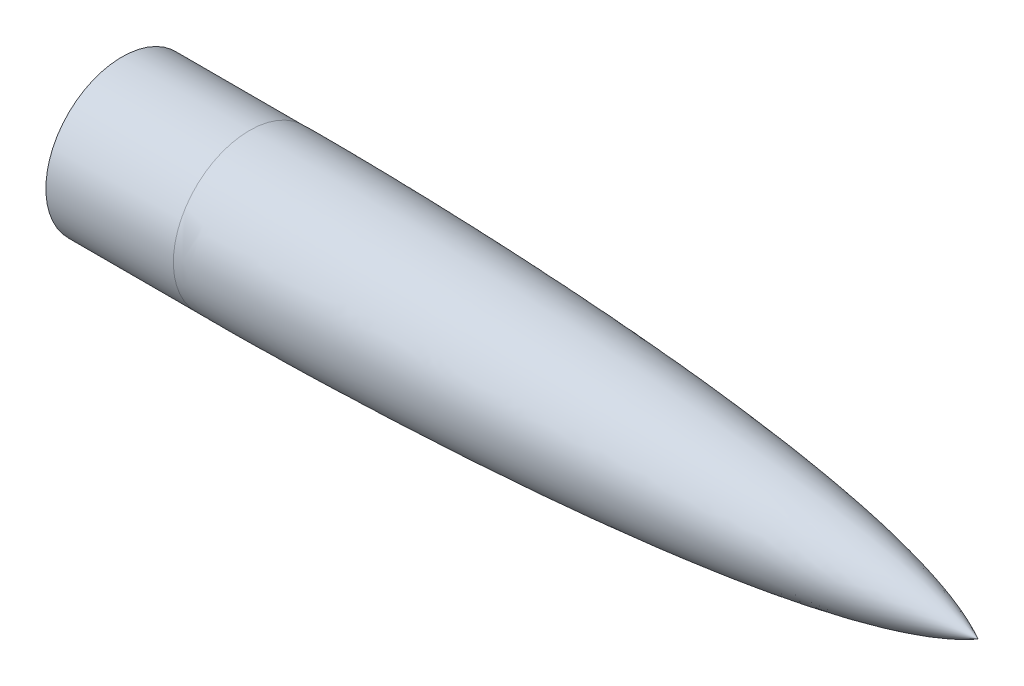
ISO-10303-21;
HEADER;
FILE_DESCRIPTION(('STEP AP214'),'2;1');
FILE_NAME('part.step','',(''),(''),'','','');
FILE_SCHEMA(('AUTOMOTIVE_DESIGN { 1 0 10303 214 1 1 1 1 }'));
ENDSEC;
DATA;
#1=APPLICATION_CONTEXT('core data for automotive mechanical design processes');
#2=APPLICATION_PROTOCOL_DEFINITION('international standard','automotive_design',2000,#1);
#3=PRODUCT_CONTEXT('',#1,'mechanical');
#4=PRODUCT('Part','Part','',(#3));
#5=PRODUCT_RELATED_PRODUCT_CATEGORY('part','',(#4));
#6=PRODUCT_DEFINITION_FORMATION('','',#4);
#7=PRODUCT_DEFINITION_CONTEXT('part definition',#1,'design');
#8=PRODUCT_DEFINITION('design','',#6,#7);
#9=PRODUCT_DEFINITION_SHAPE('','',#8);
#10=(LENGTH_UNIT() NAMED_UNIT(*) SI_UNIT(.MILLI.,.METRE.));
#11=(NAMED_UNIT(*) PLANE_ANGLE_UNIT() SI_UNIT($,.RADIAN.));
#12=(NAMED_UNIT(*) SI_UNIT($,.STERADIAN.) SOLID_ANGLE_UNIT());
#13=UNCERTAINTY_MEASURE_WITH_UNIT(LENGTH_MEASURE(1.E-05),#10,'distance_accuracy_value','');
#14=(GEOMETRIC_REPRESENTATION_CONTEXT(3) GLOBAL_UNCERTAINTY_ASSIGNED_CONTEXT((#13)) GLOBAL_UNIT_ASSIGNED_CONTEXT((#10,
#11,#12)) REPRESENTATION_CONTEXT('',''));
#15=CARTESIAN_POINT('',(0.,0.,0.));
#16=DIRECTION('',(0.,0.,1.));
#17=DIRECTION('',(1.,0.,0.));
#18=AXIS2_PLACEMENT_3D('',#15,#16,#17);
#19=CARTESIAN_POINT('',(200.,0.,0.));
#20=CARTESIAN_POINT('',(163.177563928807,19.7644163472466,0.));
#21=CARTESIAN_POINT('',(23.6648478521144,21.1638456584693,0.));
#22=CARTESIAN_POINT('',(0.,20.8999004893277,0.));
#23=B_SPLINE_CURVE_WITH_KNOTS('',3,(#19,#20,#21,#22),.UNSPECIFIED.,.F.,.F.,(4,4),(0.,1.),.UNSPECIFIED.);
#24=CARTESIAN_POINT('',(0.,0.,0.));
#25=DIRECTION('',(1.,0.,0.));
#26=AXIS1_PLACEMENT('',#24,#25);
#27=SURFACE_OF_REVOLUTION('',#23,#26);
#28=CARTESIAN_POINT('',(0.,0.,0.));
#29=DIRECTION('',(1.,0.,0.));
#30=DIRECTION('',(0.,0.,-1.));
#31=AXIS2_PLACEMENT_3D('',#28,#29,#30);
#32=CIRCLE('',#31,20.8999004893277);
#33=CARTESIAN_POINT('',(0.,0.,-20.8999004893277));
#34=VERTEX_POINT('',#33);
#35=EDGE_CURVE('E11',#34,#34,#32,.T.);
#36=ORIENTED_EDGE('',*,*,#35,.T.);
#37=EDGE_LOOP('',(#36));
#38=FACE_BOUND('',#37,.T.);
#39=CARTESIAN_POINT('',(200.,0.,0.));
#40=VERTEX_POINT('',#39);
#41=VERTEX_LOOP('',#40);
#42=FACE_BOUND('',#41,.T.);
#43=ADVANCED_FACE('F43',(#38,#42),#27,.F.);
#44=CARTESIAN_POINT('',(0.,0.,0.));
#45=DIRECTION('',(1.,0.,0.));
#46=DIRECTION('',(0.,0.,-1.));
#47=AXIS2_PLACEMENT_3D('',#44,#45,#46);
#48=CYLINDRICAL_SURFACE('',#47,20.8999004893277);
#49=CARTESIAN_POINT('',(-35.,0.,0.));
#50=DIRECTION('',(1.,0.,0.));
#51=DIRECTION('',(0.,0.,-1.));
#52=AXIS2_PLACEMENT_3D('',#49,#50,#51);
#53=CIRCLE('',#52,20.8999004893277);
#54=CARTESIAN_POINT('',(-35.,0.,-20.8999004893277));
#55=VERTEX_POINT('',#54);
#56=EDGE_CURVE('E50',#55,#55,#53,.T.);
#57=ORIENTED_EDGE('',*,*,#56,.T.);
#58=EDGE_LOOP('',(#57));
#59=FACE_BOUND('',#58,.T.);
#60=ORIENTED_EDGE('',*,*,#35,.F.);
#61=EDGE_LOOP('',(#60));
#62=FACE_BOUND('',#61,.T.);
#63=ADVANCED_FACE('F54',(#59,#62),#48,.T.);
#64=CARTESIAN_POINT('',(-35.,20.8999004893277,0.));
#65=DIRECTION('',(-1.,0.,0.));
#66=DIRECTION('',(0.,0.,1.));
#67=AXIS2_PLACEMENT_3D('',#64,#65,#66);
#68=PLANE('',#67);
#69=CARTESIAN_POINT('',(-35.,0.,0.));
#70=DIRECTION('',(1.,0.,0.));
#71=DIRECTION('',(0.,0.,-1.));
#72=AXIS2_PLACEMENT_3D('',#69,#70,#71);
#73=CIRCLE('',#72,19.3);
#74=CARTESIAN_POINT('',(-35.,0.,-19.3));
#75=VERTEX_POINT('',#74);
#76=EDGE_CURVE('E129',#75,#75,#73,.T.);
#77=ORIENTED_EDGE('',*,*,#76,.T.);
#78=EDGE_LOOP('',(#77));
#79=FACE_BOUND('',#78,.T.);
#80=ORIENTED_EDGE('',*,*,#56,.F.);
#81=EDGE_LOOP('',(#80));
#82=FACE_BOUND('',#81,.T.);
#83=ADVANCED_FACE('F59',(#79,#82),#68,.T.);
#84=CARTESIAN_POINT('',(0.,0.,0.));
#85=DIRECTION('',(1.,0.,0.));
#86=DIRECTION('',(0.,0.,-1.));
#87=AXIS2_PLACEMENT_3D('',#84,#85,#86);
#88=CYLINDRICAL_SURFACE('',#87,19.3);
#89=CARTESIAN_POINT('',(0.,0.,0.));
#90=DIRECTION('',(1.,0.,0.));
#91=DIRECTION('',(0.,0.,-1.));
#92=AXIS2_PLACEMENT_3D('',#89,#90,#91);
#93=CIRCLE('',#92,19.3);
#94=CARTESIAN_POINT('',(0.,0.,-19.3));
#95=VERTEX_POINT('',#94);
#96=EDGE_CURVE('E126',#95,#95,#93,.T.);
#97=ORIENTED_EDGE('',*,*,#96,.T.);
#98=EDGE_LOOP('',(#97));
#99=FACE_BOUND('',#98,.T.);
#100=ORIENTED_EDGE('',*,*,#76,.F.);
#101=EDGE_LOOP('',(#100));
#102=FACE_BOUND('',#101,.T.);
#103=ADVANCED_FACE('F66',(#99,#102),#88,.F.);
#104=CARTESIAN_POINT('',(0.,0.,0.));
#105=DIRECTION('',(-1.,0.,0.));
#106=DIRECTION('',(0.,0.,1.));
#107=AXIS2_PLACEMENT_3D('',#104,#105,#106);
#108=CONICAL_SURFACE('',#107,19.3,0.0459775897156513);
#109=CARTESIAN_POINT('',(41.7788060908282,0.,0.));
#110=DIRECTION('',(1.,0.,0.));
#111=DIRECTION('',(0.,0.,-1.));
#112=AXIS2_PLACEMENT_3D('',#109,#110,#111);
#113=CIRCLE('',#112,17.3777565021426);
#114=CARTESIAN_POINT('',(41.7788060908282,0.,-17.3777565021426));
#115=VERTEX_POINT('',#114);
#116=EDGE_CURVE('E121',#115,#115,#113,.T.);
#117=ORIENTED_EDGE('',*,*,#116,.T.);
#118=EDGE_LOOP('',(#117));
#119=FACE_BOUND('',#118,.T.);
#120=ORIENTED_EDGE('',*,*,#96,.F.);
#121=EDGE_LOOP('',(#120));
#122=FACE_BOUND('',#121,.T.);
#123=ADVANCED_FACE('F73',(#119,#122),#108,.F.);
#124=CARTESIAN_POINT('',(0.0334583287770024,17.9000870717573,0.));
#125=CARTESIAN_POINT('',(0.22352649051035,17.9022069912857,0.));
#126=CARTESIAN_POINT('',(0.593387162152804,17.9059752039947,0.));
#127=CARTESIAN_POINT('',(1.41536008417411,17.9129423969735,0.));
#128=CARTESIAN_POINT('',(2.53792752950207,17.9198173400902,0.));
#129=CARTESIAN_POINT('',(4.04955310983855,17.9249353806528,0.));
#130=CARTESIAN_POINT('',(6.27094424899559,17.9269925409321,0.));
#131=CARTESIAN_POINT('',(9.42357085833537,17.9196915537153,0.));
#132=CARTESIAN_POINT('',(13.7661633090196,17.8920508236841,0.));
#133=CARTESIAN_POINT('',(18.6278984506361,17.8424720302949,0.));
#134=CARTESIAN_POINT('',(25.552760725208,17.7457732329675,0.));
#135=CARTESIAN_POINT('',(32.3035612742625,17.6157017775336,0.));
#136=CARTESIAN_POINT('',(39.543960040966,17.439966200283,0.));
#137=CARTESIAN_POINT('',(44.2310651015135,17.3119466031522,0.));
#138=CARTESIAN_POINT('',(52.5431540133133,17.0557339080259,0.));
#139=CARTESIAN_POINT('',(63.714970652303,16.6478467427542,0.));
#140=CARTESIAN_POINT('',(79.0455770485472,15.9316766804066,0.));
#141=CARTESIAN_POINT('',(94.8448424482557,15.0059750368813,0.));
#142=CARTESIAN_POINT('',(110.790774364461,13.8466381155981,0.));
#143=CARTESIAN_POINT('',(126.094444393534,12.4716832921067,0.));
#144=CARTESIAN_POINT('',(137.111316027981,11.2575132064023,0.));
#145=CARTESIAN_POINT('',(145.323120967464,10.2272866552842,0.));
#146=CARTESIAN_POINT('',(150.584715234899,9.51040253126556,0.));
#147=CARTESIAN_POINT('',(159.202614387216,8.21810494688489,0.));
#148=CARTESIAN_POINT('',(167.346173818428,6.79273846909586,0.));
#149=CARTESIAN_POINT('',(175.457238950931,5.0720019160837,0.));
#150=CARTESIAN_POINT('',(181.123498747077,3.69520967911446,0.));
#151=CARTESIAN_POINT('',(186.328008319837,2.23213015597538,0.));
#152=CARTESIAN_POINT('',(190.241685823124,0.942420319701438,0.));
#153=CARTESIAN_POINT('',(193.093624066017,-0.128674101831136,0.));
#154=CARTESIAN_POINT('',(195.08742996296,-0.950802101922545,0.));
#155=CARTESIAN_POINT('',(196.619533762742,-1.64855456546143,0.));
#156=CARTESIAN_POINT('',(197.770644734379,-2.2165376524992,0.));
#157=CARTESIAN_POINT('',(198.309691787938,-2.4975628016524,0.));
#158=CARTESIAN_POINT('',(198.581210467441,-2.64330025958093,0.));
#159=B_SPLINE_CURVE_WITH_KNOTS('',3,(#124,#125,#126,#127,#128,#129,#130,#131,#132,#133,#134,
#135,#136,#137,#138,#139,#140,#141,#142,#143,#144,#145,#146,#147,#148,#149,#150,#151,#152,#153,
#154,#155,#156,#157,#158),.UNSPECIFIED.,.F.,.F.,(4,1,1,1,1,1,1,1,1,1,1,1,1,1,1,1,1,1,1,1,1,1,1,
1,1,1,1,1,1,1,1,1,4),(0.,0.0078125,0.015625,0.03125,0.046875,0.0625,0.09375,0.125,0.15625,
0.1875,0.246563546058297,0.262188546058297,0.293438546058297,0.3125,0.375,0.4375,0.5,0.5625,
0.625,0.681957493970964,0.697582493970964,0.728832493970964,0.75,0.8125,0.84375,0.875,0.90625,
0.9375,0.953125,0.96875,0.984375,0.9921875,1.),.UNSPECIFIED.);
#160=CARTESIAN_POINT('',(0.,0.,0.));
#161=DIRECTION('',(1.,0.,0.));
#162=AXIS1_PLACEMENT('',#160,#161);
#163=SURFACE_OF_REVOLUTION('',#159,#162);
#164=CARTESIAN_POINT('',(147.729601699621,0.,0.));
#165=DIRECTION('',(1.,0.,0.));
#166=DIRECTION('',(0.,0.,-1.));
#167=AXIS2_PLACEMENT_3D('',#164,#165,#166);
#168=CIRCLE('',#167,9.89479099766683);
#169=CARTESIAN_POINT('',(147.729601699621,0.,-9.89479099766683));
#170=VERTEX_POINT('',#169);
#171=EDGE_CURVE('E117',#170,#170,#168,.T.);
#172=ORIENTED_EDGE('',*,*,#171,.T.);
#173=EDGE_LOOP('',(#172));
#174=FACE_BOUND('',#173,.T.);
#175=ORIENTED_EDGE('',*,*,#116,.F.);
#176=EDGE_LOOP('',(#175));
#177=FACE_BOUND('',#176,.T.);
#178=ADVANCED_FACE('F77',(#174,#177),#163,.F.);
#179=CARTESIAN_POINT('',(147.729601699621,0.,0.));
#180=DIRECTION('',(-1.,0.,0.));
#181=DIRECTION('',(0.,0.,1.));
#182=AXIS2_PLACEMENT_3D('',#179,#180,#181);
#183=CONICAL_SURFACE('',#182,9.89479099766683,0.210943896007254);
#184=CARTESIAN_POINT('',(178.137279993562,0.,0.));
#185=DIRECTION('',(1.,0.,0.));
#186=DIRECTION('',(0.,0.,-1.));
#187=AXIS2_PLACEMENT_3D('',#184,#185,#186);
#188=CIRCLE('',#187,3.38361247614339);
#189=CARTESIAN_POINT('',(178.137279993562,0.,-3.38361247614339));
#190=VERTEX_POINT('',#189);
#191=EDGE_CURVE('E115',#190,#190,#188,.T.);
#192=ORIENTED_EDGE('',*,*,#191,.T.);
#193=EDGE_LOOP('',(#192));
#194=FACE_BOUND('',#193,.T.);
#195=ORIENTED_EDGE('',*,*,#171,.F.);
#196=EDGE_LOOP('',(#195));
#197=FACE_BOUND('',#196,.T.);
#198=ADVANCED_FACE('F82',(#194,#197),#183,.F.);
#199=CARTESIAN_POINT('',(45.6216005138898,16.2673822309674,0.));
#200=CARTESIAN_POINT('',(47.0732885996626,16.2240596192527,0.));
#201=CARTESIAN_POINT('',(49.9497340863466,16.1343082164924,0.));
#202=CARTESIAN_POINT('',(55.9165962358961,15.9313747337562,0.));
#203=CARTESIAN_POINT('',(63.597106873015,15.6364906904977,0.));
#204=CARTESIAN_POINT('',(73.1371983910233,15.2092044608215,0.));
#205=CARTESIAN_POINT('',(86.164673281101,14.5340841526702,0.));
#206=CARTESIAN_POINT('',(102.832925938043,13.4773068371395,0.));
#207=CARTESIAN_POINT('',(122.803997886716,11.821120708551,0.));
#208=CARTESIAN_POINT('',(138.883267717777,10.0787976365482,0.));
#209=CARTESIAN_POINT('',(151.082259655974,8.4457328276616,0.));
#210=CARTESIAN_POINT('',(159.816530013653,7.09639862924326,0.));
#211=CARTESIAN_POINT('',(168.051918579596,5.61820219154597,0.));
#212=CARTESIAN_POINT('',(173.736739232049,4.421655718933,0.));
#213=CARTESIAN_POINT('',(177.304712907982,3.58739836732934,0.));
#214=CARTESIAN_POINT('',(178.728360836672,3.2402922263651,0.));
#215=CARTESIAN_POINT('',(180.511240952889,2.79077581279286,0.));
#216=CARTESIAN_POINT('',(182.135744264954,2.36138947064286,0.));
#217=CARTESIAN_POINT('',(183.704548280726,1.92284282748151,0.));
#218=CARTESIAN_POINT('',(184.769574825266,1.61563270175172,0.));
#219=CARTESIAN_POINT('',(185.916297078439,1.27509387600465,0.));
#220=CARTESIAN_POINT('',(187.289435753117,0.849647216863108,0.));
#221=CARTESIAN_POINT('',(188.25957685361,0.533434111976146,0.));
#222=CARTESIAN_POINT('',(188.748865911413,0.369654147481144,0.));
#223=B_SPLINE_CURVE_WITH_KNOTS('',3,(#199,#200,#201,#202,#203,#204,#205,#206,#207,#208,#209,
#210,#211,#212,#213,#214,#215,#216,#217,#218,#219,#220,#221,#222),.UNSPECIFIED.,.F.,.F.,(4,1,1,
1,1,1,1,1,1,1,1,1,1,1,1,1,1,1,1,1,1,4),(0.295743661142382,0.315396550631427,0.335049440120473,
0.374355219098564,0.413660998076654,0.452966777054745,0.531578335010927,0.610189892967109,
0.688801450923291,0.728107229901382,0.767413008879473,0.806718787857564,0.846024566835655,
0.85502595781398,0.864852402558503,0.869765624930764,0.885330345813746,0.893241051143312,
0.898154273515573,0.904983235302791,0.914809680047314,0.924636124791837),.UNSPECIFIED.);
#224=CARTESIAN_POINT('',(0.,0.,0.));
#225=DIRECTION('',(1.,0.,0.));
#226=AXIS1_PLACEMENT('',#224,#225);
#227=SURFACE_OF_REVOLUTION('',#223,#226);
#228=CARTESIAN_POINT('',(184.265857104324,0.,0.));
#229=DIRECTION('',(1.,0.,0.));
#230=DIRECTION('',(0.,0.,-1.));
#231=AXIS2_PLACEMENT_3D('',#228,#229,#230);
#232=CIRCLE('',#231,1.76069940647757);
#233=CARTESIAN_POINT('',(184.265857104324,0.,-1.76069940647757));
#234=VERTEX_POINT('',#233);
#235=EDGE_CURVE('E99',#234,#234,#232,.T.);
#236=ORIENTED_EDGE('',*,*,#235,.T.);
#237=EDGE_LOOP('',(#236));
#238=FACE_BOUND('',#237,.T.);
#239=ORIENTED_EDGE('',*,*,#191,.F.);
#240=EDGE_LOOP('',(#239));
#241=FACE_BOUND('',#240,.T.);
#242=ADVANCED_FACE('F104',(#238,#241),#227,.F.);
#243=CARTESIAN_POINT('',(183.708009807957,0.,0.));
#244=DIRECTION('',(1.,0.,0.));
#245=DIRECTION('',(0.,1.,0.));
#246=AXIS2_PLACEMENT_3D('',#243,#244,#245);
#247=SPHERICAL_SURFACE('',#246,1.84695858265251);
#248=ORIENTED_EDGE('',*,*,#235,.F.);
#249=EDGE_LOOP('',(#248));
#250=FACE_BOUND('',#249,.T.);
#251=ADVANCED_FACE('F107',(#250),#247,.F.);
#252=CLOSED_SHELL('',(#43,#63,#83,#103,#123,#178,#198,#242,#251));
#253=MANIFOLD_SOLID_BREP('B2',#252);
#254=ADVANCED_BREP_SHAPE_REPRESENTATION('',(#18,#253),#14);
#255=SHAPE_DEFINITION_REPRESENTATION(#9,#254);
ENDSEC;
END-ISO-10303-21;
